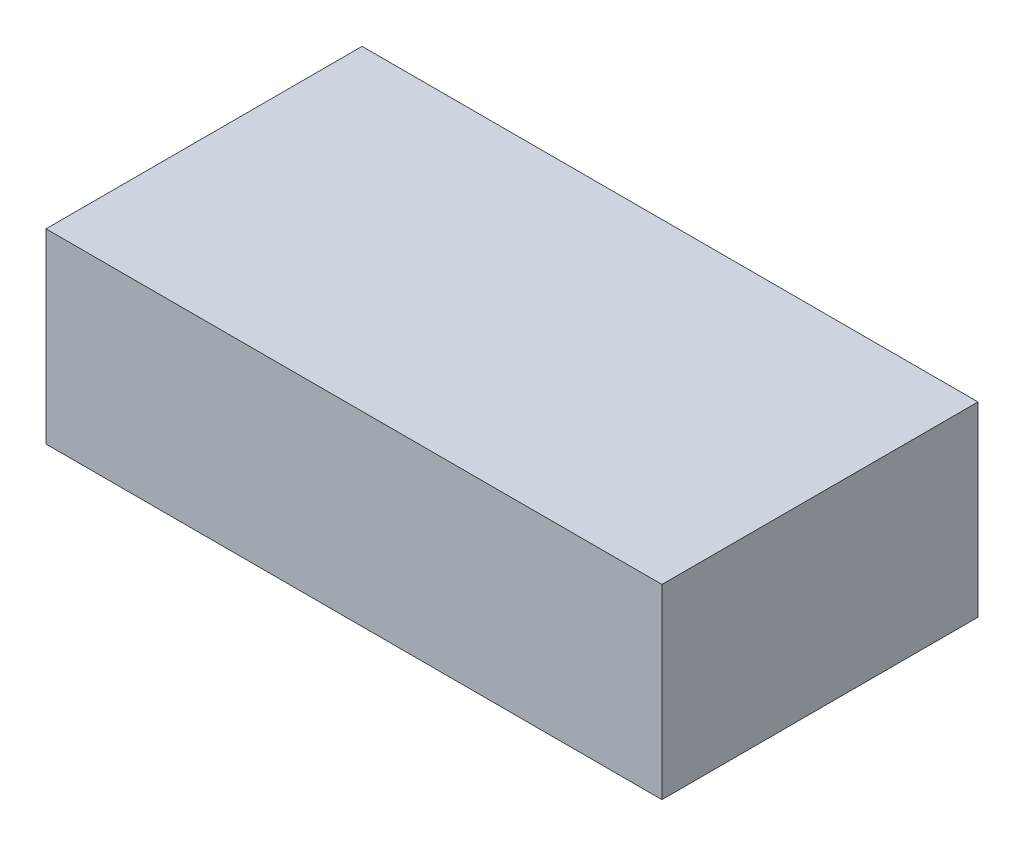
ISO-10303-21;
HEADER;
FILE_DESCRIPTION(('STEP AP214'),'2;1');
FILE_NAME('part.step','',(''),(''),'','','');
FILE_SCHEMA(('AUTOMOTIVE_DESIGN { 1 0 10303 214 1 1 1 1 }'));
ENDSEC;
DATA;
#1=APPLICATION_CONTEXT('core data for automotive mechanical design processes');
#2=APPLICATION_PROTOCOL_DEFINITION('international standard','automotive_design',2000,#1);
#3=PRODUCT_CONTEXT('',#1,'mechanical');
#4=PRODUCT('Part','Part','',(#3));
#5=PRODUCT_RELATED_PRODUCT_CATEGORY('part','',(#4));
#6=PRODUCT_DEFINITION_FORMATION('','',#4);
#7=PRODUCT_DEFINITION_CONTEXT('part definition',#1,'design');
#8=PRODUCT_DEFINITION('design','',#6,#7);
#9=PRODUCT_DEFINITION_SHAPE('','',#8);
#10=(LENGTH_UNIT() NAMED_UNIT(*) SI_UNIT(.MILLI.,.METRE.));
#11=(NAMED_UNIT(*) PLANE_ANGLE_UNIT() SI_UNIT($,.RADIAN.));
#12=(NAMED_UNIT(*) SI_UNIT($,.STERADIAN.) SOLID_ANGLE_UNIT());
#13=UNCERTAINTY_MEASURE_WITH_UNIT(LENGTH_MEASURE(1.E-05),#10,'distance_accuracy_value','');
#14=(GEOMETRIC_REPRESENTATION_CONTEXT(3) GLOBAL_UNCERTAINTY_ASSIGNED_CONTEXT((#13)) GLOBAL_UNIT_ASSIGNED_CONTEXT((#10,
#11,#12)) REPRESENTATION_CONTEXT('',''));
#15=CARTESIAN_POINT('',(0.,0.,0.));
#16=DIRECTION('',(0.,0.,1.));
#17=DIRECTION('',(1.,0.,0.));
#18=AXIS2_PLACEMENT_3D('',#15,#16,#17);
#19=CARTESIAN_POINT('',(0.,23.,0.));
#20=DIRECTION('',(1.,0.,0.));
#21=DIRECTION('',(0.,0.,-1.));
#22=AXIS2_PLACEMENT_3D('',#19,#20,#21);
#23=PLANE('',#22);
#24=DIRECTION('',(0.,0.,1.));
#25=VECTOR('',#24,1.);
#26=CARTESIAN_POINT('',(0.,0.,0.));
#27=LINE('',#26,#25);
#28=CARTESIAN_POINT('',(0.,0.,0.));
#29=VERTEX_POINT('',#28);
#30=CARTESIAN_POINT('',(0.,0.,39.));
#31=VERTEX_POINT('',#30);
#32=EDGE_CURVE('E105',#29,#31,#27,.T.);
#33=ORIENTED_EDGE('',*,*,#32,.T.);
#34=DIRECTION('',(0.,-1.,0.));
#35=VECTOR('',#34,1.);
#36=CARTESIAN_POINT('',(0.,23.,39.));
#37=LINE('',#36,#35);
#38=CARTESIAN_POINT('',(0.,23.,39.));
#39=VERTEX_POINT('',#38);
#40=EDGE_CURVE('E11',#39,#31,#37,.T.);
#41=ORIENTED_EDGE('',*,*,#40,.F.);
#42=DIRECTION('',(0.,0.,1.));
#43=VECTOR('',#42,1.);
#44=CARTESIAN_POINT('',(0.,23.,0.));
#45=LINE('',#44,#43);
#46=CARTESIAN_POINT('',(0.,23.,0.));
#47=VERTEX_POINT('',#46);
#48=EDGE_CURVE('E89',#47,#39,#45,.T.);
#49=ORIENTED_EDGE('',*,*,#48,.F.);
#50=DIRECTION('',(0.,-1.,0.));
#51=VECTOR('',#50,1.);
#52=CARTESIAN_POINT('',(0.,23.,0.));
#53=LINE('',#52,#51);
#54=EDGE_CURVE('E98',#47,#29,#53,.T.);
#55=ORIENTED_EDGE('',*,*,#54,.T.);
#56=EDGE_LOOP('',(#33,#41,#49,#55));
#57=FACE_BOUND('',#56,.T.);
#58=ADVANCED_FACE('F39',(#57),#23,.F.);
#59=CARTESIAN_POINT('',(0.,23.,39.));
#60=DIRECTION('',(0.,0.,-1.));
#61=DIRECTION('',(-1.,0.,0.));
#62=AXIS2_PLACEMENT_3D('',#59,#60,#61);
#63=PLANE('',#62);
#64=DIRECTION('',(1.,0.,0.));
#65=VECTOR('',#64,1.);
#66=CARTESIAN_POINT('',(0.,0.,39.));
#67=LINE('',#66,#65);
#68=CARTESIAN_POINT('',(76.,0.,39.));
#69=VERTEX_POINT('',#68);
#70=EDGE_CURVE('E94',#31,#69,#67,.T.);
#71=ORIENTED_EDGE('',*,*,#70,.T.);
#72=DIRECTION('',(0.,-1.,0.));
#73=VECTOR('',#72,1.);
#74=CARTESIAN_POINT('',(76.,23.,39.));
#75=LINE('',#74,#73);
#76=CARTESIAN_POINT('',(76.,23.,39.));
#77=VERTEX_POINT('',#76);
#78=EDGE_CURVE('E50',#77,#69,#75,.T.);
#79=ORIENTED_EDGE('',*,*,#78,.F.);
#80=DIRECTION('',(1.,0.,0.));
#81=VECTOR('',#80,1.);
#82=CARTESIAN_POINT('',(0.,23.,39.));
#83=LINE('',#82,#81);
#84=EDGE_CURVE('E84',#39,#77,#83,.T.);
#85=ORIENTED_EDGE('',*,*,#84,.F.);
#86=ORIENTED_EDGE('',*,*,#40,.T.);
#87=EDGE_LOOP('',(#71,#79,#85,#86));
#88=FACE_BOUND('',#87,.T.);
#89=ADVANCED_FACE('F91',(#88),#63,.F.);
#90=CARTESIAN_POINT('',(76.,23.,0.));
#91=DIRECTION('',(-1.,0.,0.));
#92=DIRECTION('',(0.,0.,1.));
#93=AXIS2_PLACEMENT_3D('',#90,#91,#92);
#94=PLANE('',#93);
#95=DIRECTION('',(0.,0.,-1.));
#96=VECTOR('',#95,1.);
#97=CARTESIAN_POINT('',(76.,0.,0.));
#98=LINE('',#97,#96);
#99=CARTESIAN_POINT('',(76.,0.,0.));
#100=VERTEX_POINT('',#99);
#101=EDGE_CURVE('E75',#69,#100,#98,.T.);
#102=ORIENTED_EDGE('',*,*,#101,.T.);
#103=DIRECTION('',(0.,-1.,0.));
#104=VECTOR('',#103,1.);
#105=CARTESIAN_POINT('',(76.,23.,0.));
#106=LINE('',#105,#104);
#107=CARTESIAN_POINT('',(76.,23.,0.));
#108=VERTEX_POINT('',#107);
#109=EDGE_CURVE('E92',#108,#100,#106,.T.);
#110=ORIENTED_EDGE('',*,*,#109,.F.);
#111=DIRECTION('',(0.,0.,-1.));
#112=VECTOR('',#111,1.);
#113=CARTESIAN_POINT('',(76.,23.,0.));
#114=LINE('',#113,#112);
#115=EDGE_CURVE('E86',#77,#108,#114,.T.);
#116=ORIENTED_EDGE('',*,*,#115,.F.);
#117=ORIENTED_EDGE('',*,*,#78,.T.);
#118=EDGE_LOOP('',(#102,#110,#116,#117));
#119=FACE_BOUND('',#118,.T.);
#120=ADVANCED_FACE('F96',(#119),#94,.F.);
#121=CARTESIAN_POINT('',(0.,23.,0.));
#122=DIRECTION('',(0.,0.,1.));
#123=DIRECTION('',(1.,0.,0.));
#124=AXIS2_PLACEMENT_3D('',#121,#122,#123);
#125=PLANE('',#124);
#126=DIRECTION('',(-1.,0.,0.));
#127=VECTOR('',#126,1.);
#128=CARTESIAN_POINT('',(0.,0.,0.));
#129=LINE('',#128,#127);
#130=EDGE_CURVE('E79',#100,#29,#129,.T.);
#131=ORIENTED_EDGE('',*,*,#130,.T.);
#132=ORIENTED_EDGE('',*,*,#54,.F.);
#133=DIRECTION('',(-1.,0.,0.));
#134=VECTOR('',#133,1.);
#135=CARTESIAN_POINT('',(0.,23.,0.));
#136=LINE('',#135,#134);
#137=EDGE_CURVE('E54',#108,#47,#136,.T.);
#138=ORIENTED_EDGE('',*,*,#137,.F.);
#139=ORIENTED_EDGE('',*,*,#109,.T.);
#140=EDGE_LOOP('',(#131,#132,#138,#139));
#141=FACE_BOUND('',#140,.T.);
#142=ADVANCED_FACE('F108',(#141),#125,.F.);
#143=CARTESIAN_POINT('',(0.,23.,0.));
#144=DIRECTION('',(0.,1.,0.));
#145=DIRECTION('',(0.,0.,1.));
#146=AXIS2_PLACEMENT_3D('',#143,#144,#145);
#147=PLANE('',#146);
#148=ORIENTED_EDGE('',*,*,#48,.T.);
#149=ORIENTED_EDGE('',*,*,#84,.T.);
#150=ORIENTED_EDGE('',*,*,#115,.T.);
#151=ORIENTED_EDGE('',*,*,#137,.T.);
#152=EDGE_LOOP('',(#148,#149,#150,#151));
#153=FACE_BOUND('',#152,.T.);
#154=ADVANCED_FACE('F88',(#153),#147,.T.);
#155=CARTESIAN_POINT('',(0.,0.,0.));
#156=DIRECTION('',(0.,1.,0.));
#157=DIRECTION('',(0.,0.,1.));
#158=AXIS2_PLACEMENT_3D('',#155,#156,#157);
#159=PLANE('',#158);
#160=ORIENTED_EDGE('',*,*,#32,.F.);
#161=ORIENTED_EDGE('',*,*,#130,.F.);
#162=ORIENTED_EDGE('',*,*,#101,.F.);
#163=ORIENTED_EDGE('',*,*,#70,.F.);
#164=EDGE_LOOP('',(#160,#161,#162,#163));
#165=FACE_BOUND('',#164,.T.);
#166=ADVANCED_FACE('F115',(#165),#159,.F.);
#167=CLOSED_SHELL('',(#58,#89,#120,#142,#154,#166));
#168=MANIFOLD_SOLID_BREP('B2',#167);
#169=ADVANCED_BREP_SHAPE_REPRESENTATION('',(#18,#168),#14);
#170=SHAPE_DEFINITION_REPRESENTATION(#9,#169);
ENDSEC;
END-ISO-10303-21;
